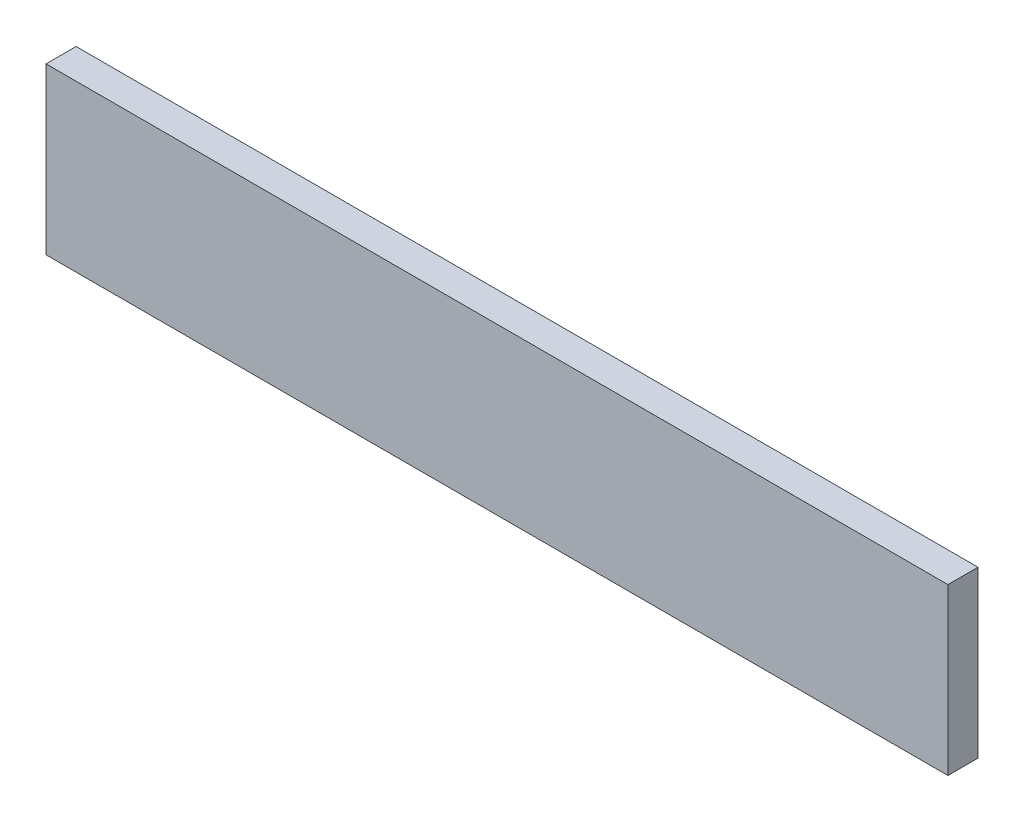
ISO-10303-21;
HEADER;
FILE_DESCRIPTION(('STEP AP214'),'2;1');
FILE_NAME('part.step','',(''),(''),'','','');
FILE_SCHEMA(('AUTOMOTIVE_DESIGN { 1 0 10303 214 1 1 1 1 }'));
ENDSEC;
DATA;
#1=APPLICATION_CONTEXT('core data for automotive mechanical design processes');
#2=APPLICATION_PROTOCOL_DEFINITION('international standard','automotive_design',2000,#1);
#3=PRODUCT_CONTEXT('',#1,'mechanical');
#4=PRODUCT('Part','Part','',(#3));
#5=PRODUCT_RELATED_PRODUCT_CATEGORY('part','',(#4));
#6=PRODUCT_DEFINITION_FORMATION('','',#4);
#7=PRODUCT_DEFINITION_CONTEXT('part definition',#1,'design');
#8=PRODUCT_DEFINITION('design','',#6,#7);
#9=PRODUCT_DEFINITION_SHAPE('','',#8);
#10=(LENGTH_UNIT() NAMED_UNIT(*) SI_UNIT(.MILLI.,.METRE.));
#11=(NAMED_UNIT(*) PLANE_ANGLE_UNIT() SI_UNIT($,.RADIAN.));
#12=(NAMED_UNIT(*) SI_UNIT($,.STERADIAN.) SOLID_ANGLE_UNIT());
#13=UNCERTAINTY_MEASURE_WITH_UNIT(LENGTH_MEASURE(1.E-05),#10,'distance_accuracy_value','');
#14=(GEOMETRIC_REPRESENTATION_CONTEXT(3) GLOBAL_UNCERTAINTY_ASSIGNED_CONTEXT((#13)) GLOBAL_UNIT_ASSIGNED_CONTEXT((#10,
#11,#12)) REPRESENTATION_CONTEXT('',''));
#15=CARTESIAN_POINT('',(0.,0.,0.));
#16=DIRECTION('',(0.,0.,1.));
#17=DIRECTION('',(1.,0.,0.));
#18=AXIS2_PLACEMENT_3D('',#15,#16,#17);
#19=CARTESIAN_POINT('',(0.,0.,2.));
#20=DIRECTION('',(1.,0.,0.));
#21=DIRECTION('',(0.,0.,-1.));
#22=AXIS2_PLACEMENT_3D('',#19,#20,#21);
#23=PLANE('',#22);
#24=DIRECTION('',(0.,-1.,0.));
#25=VECTOR('',#24,1.);
#26=CARTESIAN_POINT('',(0.,0.,0.));
#27=LINE('',#26,#25);
#28=CARTESIAN_POINT('',(0.,11.,0.));
#29=VERTEX_POINT('',#28);
#30=CARTESIAN_POINT('',(0.,0.,0.));
#31=VERTEX_POINT('',#30);
#32=EDGE_CURVE('E96',#29,#31,#27,.T.);
#33=ORIENTED_EDGE('',*,*,#32,.T.);
#34=DIRECTION('',(0.,0.,-1.));
#35=VECTOR('',#34,1.);
#36=CARTESIAN_POINT('',(0.,0.,2.));
#37=LINE('',#36,#35);
#38=CARTESIAN_POINT('',(0.,0.,2.));
#39=VERTEX_POINT('',#38);
#40=EDGE_CURVE('E11',#39,#31,#37,.T.);
#41=ORIENTED_EDGE('',*,*,#40,.F.);
#42=DIRECTION('',(0.,-1.,0.));
#43=VECTOR('',#42,1.);
#44=CARTESIAN_POINT('',(0.,0.,2.));
#45=LINE('',#44,#43);
#46=CARTESIAN_POINT('',(0.,11.,2.));
#47=VERTEX_POINT('',#46);
#48=EDGE_CURVE('E84',#47,#39,#45,.T.);
#49=ORIENTED_EDGE('',*,*,#48,.F.);
#50=DIRECTION('',(0.,0.,-1.));
#51=VECTOR('',#50,1.);
#52=CARTESIAN_POINT('',(0.,11.,2.));
#53=LINE('',#52,#51);
#54=EDGE_CURVE('E92',#47,#29,#53,.T.);
#55=ORIENTED_EDGE('',*,*,#54,.T.);
#56=EDGE_LOOP('',(#33,#41,#49,#55));
#57=FACE_BOUND('',#56,.T.);
#58=ADVANCED_FACE('F33',(#57),#23,.F.);
#59=CARTESIAN_POINT('',(0.,0.,2.));
#60=DIRECTION('',(0.,1.,0.));
#61=DIRECTION('',(0.,0.,1.));
#62=AXIS2_PLACEMENT_3D('',#59,#60,#61);
#63=PLANE('',#62);
#64=DIRECTION('',(1.,0.,0.));
#65=VECTOR('',#64,1.);
#66=CARTESIAN_POINT('',(0.,0.,0.));
#67=LINE('',#66,#65);
#68=CARTESIAN_POINT('',(60.,0.,0.));
#69=VERTEX_POINT('',#68);
#70=EDGE_CURVE('E88',#31,#69,#67,.T.);
#71=ORIENTED_EDGE('',*,*,#70,.T.);
#72=DIRECTION('',(0.,0.,-1.));
#73=VECTOR('',#72,1.);
#74=CARTESIAN_POINT('',(60.,0.,2.));
#75=LINE('',#74,#73);
#76=CARTESIAN_POINT('',(60.,0.,2.));
#77=VERTEX_POINT('',#76);
#78=EDGE_CURVE('E41',#77,#69,#75,.T.);
#79=ORIENTED_EDGE('',*,*,#78,.F.);
#80=DIRECTION('',(1.,0.,0.));
#81=VECTOR('',#80,1.);
#82=CARTESIAN_POINT('',(0.,0.,2.));
#83=LINE('',#82,#81);
#84=EDGE_CURVE('E79',#39,#77,#83,.T.);
#85=ORIENTED_EDGE('',*,*,#84,.F.);
#86=ORIENTED_EDGE('',*,*,#40,.T.);
#87=EDGE_LOOP('',(#71,#79,#85,#86));
#88=FACE_BOUND('',#87,.T.);
#89=ADVANCED_FACE('F87',(#88),#63,.F.);
#90=CARTESIAN_POINT('',(60.,0.,2.));
#91=DIRECTION('',(-1.,0.,0.));
#92=DIRECTION('',(0.,0.,1.));
#93=AXIS2_PLACEMENT_3D('',#90,#91,#92);
#94=PLANE('',#93);
#95=DIRECTION('',(0.,1.,0.));
#96=VECTOR('',#95,1.);
#97=CARTESIAN_POINT('',(60.,0.,0.));
#98=LINE('',#97,#96);
#99=CARTESIAN_POINT('',(60.,11.,0.));
#100=VERTEX_POINT('',#99);
#101=EDGE_CURVE('E66',#69,#100,#98,.T.);
#102=ORIENTED_EDGE('',*,*,#101,.T.);
#103=DIRECTION('',(0.,0.,-1.));
#104=VECTOR('',#103,1.);
#105=CARTESIAN_POINT('',(60.,11.,2.));
#106=LINE('',#105,#104);
#107=CARTESIAN_POINT('',(60.,11.,2.));
#108=VERTEX_POINT('',#107);
#109=EDGE_CURVE('E89',#108,#100,#106,.T.);
#110=ORIENTED_EDGE('',*,*,#109,.F.);
#111=DIRECTION('',(0.,1.,0.));
#112=VECTOR('',#111,1.);
#113=CARTESIAN_POINT('',(60.,0.,2.));
#114=LINE('',#113,#112);
#115=EDGE_CURVE('E82',#77,#108,#114,.T.);
#116=ORIENTED_EDGE('',*,*,#115,.F.);
#117=ORIENTED_EDGE('',*,*,#78,.T.);
#118=EDGE_LOOP('',(#102,#110,#116,#117));
#119=FACE_BOUND('',#118,.T.);
#120=ADVANCED_FACE('F90',(#119),#94,.F.);
#121=CARTESIAN_POINT('',(0.,11.,2.));
#122=DIRECTION('',(0.,-1.,0.));
#123=DIRECTION('',(0.,0.,-1.));
#124=AXIS2_PLACEMENT_3D('',#121,#122,#123);
#125=PLANE('',#124);
#126=DIRECTION('',(-1.,0.,0.));
#127=VECTOR('',#126,1.);
#128=CARTESIAN_POINT('',(0.,11.,0.));
#129=LINE('',#128,#127);
#130=EDGE_CURVE('E72',#100,#29,#129,.T.);
#131=ORIENTED_EDGE('',*,*,#130,.T.);
#132=ORIENTED_EDGE('',*,*,#54,.F.);
#133=DIRECTION('',(-1.,0.,0.));
#134=VECTOR('',#133,1.);
#135=CARTESIAN_POINT('',(0.,11.,2.));
#136=LINE('',#135,#134);
#137=EDGE_CURVE('E49',#108,#47,#136,.T.);
#138=ORIENTED_EDGE('',*,*,#137,.F.);
#139=ORIENTED_EDGE('',*,*,#109,.T.);
#140=EDGE_LOOP('',(#131,#132,#138,#139));
#141=FACE_BOUND('',#140,.T.);
#142=ADVANCED_FACE('F103',(#141),#125,.F.);
#143=CARTESIAN_POINT('',(0.,0.,2.));
#144=DIRECTION('',(0.,0.,-1.));
#145=DIRECTION('',(-1.,0.,0.));
#146=AXIS2_PLACEMENT_3D('',#143,#144,#145);
#147=PLANE('',#146);
#148=ORIENTED_EDGE('',*,*,#48,.T.);
#149=ORIENTED_EDGE('',*,*,#84,.T.);
#150=ORIENTED_EDGE('',*,*,#115,.T.);
#151=ORIENTED_EDGE('',*,*,#137,.T.);
#152=EDGE_LOOP('',(#148,#149,#150,#151));
#153=FACE_BOUND('',#152,.T.);
#154=ADVANCED_FACE('F80',(#153),#147,.F.);
#155=CARTESIAN_POINT('',(0.,0.,0.));
#156=DIRECTION('',(0.,0.,-1.));
#157=DIRECTION('',(-1.,0.,0.));
#158=AXIS2_PLACEMENT_3D('',#155,#156,#157);
#159=PLANE('',#158);
#160=ORIENTED_EDGE('',*,*,#32,.F.);
#161=ORIENTED_EDGE('',*,*,#130,.F.);
#162=ORIENTED_EDGE('',*,*,#101,.F.);
#163=ORIENTED_EDGE('',*,*,#70,.F.);
#164=EDGE_LOOP('',(#160,#161,#162,#163));
#165=FACE_BOUND('',#164,.T.);
#166=ADVANCED_FACE('F106',(#165),#159,.T.);
#167=CLOSED_SHELL('',(#58,#89,#120,#142,#154,#166));
#168=MANIFOLD_SOLID_BREP('B2',#167);
#169=ADVANCED_BREP_SHAPE_REPRESENTATION('',(#18,#168),#14);
#170=SHAPE_DEFINITION_REPRESENTATION(#9,#169);
ENDSEC;
END-ISO-10303-21;
